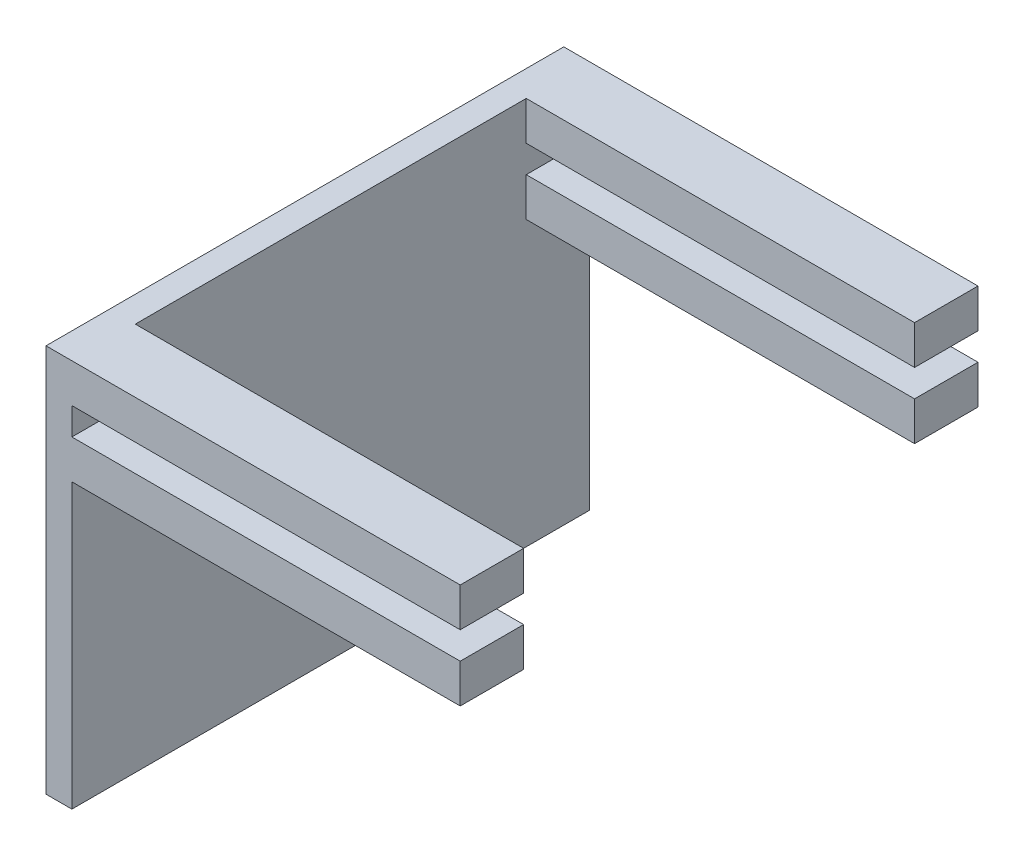
ISO-10303-21;
HEADER;
FILE_DESCRIPTION(('STEP AP214'),'2;1');
FILE_NAME('part.step','',(''),(''),'','','');
FILE_SCHEMA(('AUTOMOTIVE_DESIGN { 1 0 10303 214 1 1 1 1 }'));
ENDSEC;
DATA;
#1=APPLICATION_CONTEXT('core data for automotive mechanical design processes');
#2=APPLICATION_PROTOCOL_DEFINITION('international standard','automotive_design',2000,#1);
#3=PRODUCT_CONTEXT('',#1,'mechanical');
#4=PRODUCT('Part','Part','',(#3));
#5=PRODUCT_RELATED_PRODUCT_CATEGORY('part','',(#4));
#6=PRODUCT_DEFINITION_FORMATION('','',#4);
#7=PRODUCT_DEFINITION_CONTEXT('part definition',#1,'design');
#8=PRODUCT_DEFINITION('design','',#6,#7);
#9=PRODUCT_DEFINITION_SHAPE('','',#8);
#10=(LENGTH_UNIT() NAMED_UNIT(*) SI_UNIT(.MILLI.,.METRE.));
#11=(NAMED_UNIT(*) PLANE_ANGLE_UNIT() SI_UNIT($,.RADIAN.));
#12=(NAMED_UNIT(*) SI_UNIT($,.STERADIAN.) SOLID_ANGLE_UNIT());
#13=UNCERTAINTY_MEASURE_WITH_UNIT(LENGTH_MEASURE(1.E-05),#10,'distance_accuracy_value','');
#14=(GEOMETRIC_REPRESENTATION_CONTEXT(3) GLOBAL_UNCERTAINTY_ASSIGNED_CONTEXT((#13)) GLOBAL_UNIT_ASSIGNED_CONTEXT((#10,
#11,#12)) REPRESENTATION_CONTEXT('',''));
#15=CARTESIAN_POINT('',(0.,0.,0.));
#16=DIRECTION('',(0.,0.,1.));
#17=DIRECTION('',(1.,0.,0.));
#18=AXIS2_PLACEMENT_3D('',#15,#16,#17);
#19=CARTESIAN_POINT('',(2.,0.,40.));
#20=DIRECTION('',(-1.,0.,0.));
#21=DIRECTION('',(0.,0.,1.));
#22=AXIS2_PLACEMENT_3D('',#19,#20,#21);
#23=PLANE('',#22);
#24=DIRECTION('',(0.,0.,1.));
#25=VECTOR('',#24,1.);
#26=CARTESIAN_POINT('',(2.,24.9,0.));
#27=LINE('',#26,#25);
#28=CARTESIAN_POINT('',(2.,24.9,0.));
#29=VERTEX_POINT('',#28);
#30=CARTESIAN_POINT('',(2.,24.9,4.9));
#31=VERTEX_POINT('',#30);
#32=EDGE_CURVE('E282',#29,#31,#27,.T.);
#33=ORIENTED_EDGE('',*,*,#32,.F.);
#34=DIRECTION('',(0.,1.,0.));
#35=VECTOR('',#34,1.);
#36=CARTESIAN_POINT('',(2.,0.,0.));
#37=LINE('',#36,#35);
#38=CARTESIAN_POINT('',(2.,27.,0.));
#39=VERTEX_POINT('',#38);
#40=EDGE_CURVE('E469',#29,#39,#37,.T.);
#41=ORIENTED_EDGE('',*,*,#40,.T.);
#42=DIRECTION('',(0.,0.,-1.));
#43=VECTOR('',#42,1.);
#44=CARTESIAN_POINT('',(2.,27.,0.));
#45=LINE('',#44,#43);
#46=CARTESIAN_POINT('',(2.,27.,4.9));
#47=VERTEX_POINT('',#46);
#48=EDGE_CURVE('E383',#47,#39,#45,.T.);
#49=ORIENTED_EDGE('',*,*,#48,.F.);
#50=DIRECTION('',(0.,-1.,0.));
#51=VECTOR('',#50,1.);
#52=CARTESIAN_POINT('',(2.,30.,4.9));
#53=LINE('',#52,#51);
#54=CARTESIAN_POINT('',(2.,30.,4.9));
#55=VERTEX_POINT('',#54);
#56=EDGE_CURVE('E377',#55,#47,#53,.T.);
#57=ORIENTED_EDGE('',*,*,#56,.F.);
#58=DIRECTION('',(0.,0.,-1.));
#59=VECTOR('',#58,1.);
#60=CARTESIAN_POINT('',(2.,30.,40.));
#61=LINE('',#60,#59);
#62=CARTESIAN_POINT('',(2.,30.,35.1));
#63=VERTEX_POINT('',#62);
#64=EDGE_CURVE('E478',#63,#55,#61,.T.);
#65=ORIENTED_EDGE('',*,*,#64,.F.);
#66=DIRECTION('',(0.,1.,0.));
#67=VECTOR('',#66,1.);
#68=CARTESIAN_POINT('',(2.,30.,35.1));
#69=LINE('',#68,#67);
#70=CARTESIAN_POINT('',(2.,27.,35.1));
#71=VERTEX_POINT('',#70);
#72=EDGE_CURVE('E416',#71,#63,#69,.T.);
#73=ORIENTED_EDGE('',*,*,#72,.F.);
#74=DIRECTION('',(0.,0.,-1.));
#75=VECTOR('',#74,1.);
#76=CARTESIAN_POINT('',(2.,27.,40.));
#77=LINE('',#76,#75);
#78=CARTESIAN_POINT('',(2.,27.,40.));
#79=VERTEX_POINT('',#78);
#80=EDGE_CURVE('E410',#79,#71,#77,.T.);
#81=ORIENTED_EDGE('',*,*,#80,.F.);
#82=DIRECTION('',(0.,1.,0.));
#83=VECTOR('',#82,1.);
#84=CARTESIAN_POINT('',(2.,0.,40.));
#85=LINE('',#84,#83);
#86=CARTESIAN_POINT('',(2.,24.9,40.));
#87=VERTEX_POINT('',#86);
#88=EDGE_CURVE('E453',#87,#79,#85,.T.);
#89=ORIENTED_EDGE('',*,*,#88,.F.);
#90=DIRECTION('',(0.,0.,1.));
#91=VECTOR('',#90,1.);
#92=CARTESIAN_POINT('',(2.,24.9,40.));
#93=LINE('',#92,#91);
#94=CARTESIAN_POINT('',(2.,24.9,35.1));
#95=VERTEX_POINT('',#94);
#96=EDGE_CURVE('E346',#95,#87,#93,.T.);
#97=ORIENTED_EDGE('',*,*,#96,.F.);
#98=DIRECTION('',(0.,1.,0.));
#99=VECTOR('',#98,1.);
#100=CARTESIAN_POINT('',(2.,24.9,35.1));
#101=LINE('',#100,#99);
#102=CARTESIAN_POINT('',(2.,21.9,35.1));
#103=VERTEX_POINT('',#102);
#104=EDGE_CURVE('E358',#103,#95,#101,.T.);
#105=ORIENTED_EDGE('',*,*,#104,.F.);
#106=DIRECTION('',(0.,0.,-1.));
#107=VECTOR('',#106,1.);
#108=CARTESIAN_POINT('',(2.,21.9,40.));
#109=LINE('',#108,#107);
#110=CARTESIAN_POINT('',(2.,21.9,40.));
#111=VERTEX_POINT('',#110);
#112=EDGE_CURVE('E340',#111,#103,#109,.T.);
#113=ORIENTED_EDGE('',*,*,#112,.F.);
#114=CARTESIAN_POINT('',(2.,0.,40.));
#115=VERTEX_POINT('',#114);
#116=EDGE_CURVE('E454',#115,#111,#85,.T.);
#117=ORIENTED_EDGE('',*,*,#116,.F.);
#118=DIRECTION('',(0.,0.,-1.));
#119=VECTOR('',#118,1.);
#120=CARTESIAN_POINT('',(2.,0.,40.));
#121=LINE('',#120,#119);
#122=CARTESIAN_POINT('',(2.,0.,0.));
#123=VERTEX_POINT('',#122);
#124=EDGE_CURVE('E50',#115,#123,#121,.T.);
#125=ORIENTED_EDGE('',*,*,#124,.T.);
#126=CARTESIAN_POINT('',(2.,21.9,0.));
#127=VERTEX_POINT('',#126);
#128=EDGE_CURVE('E470',#123,#127,#37,.T.);
#129=ORIENTED_EDGE('',*,*,#128,.T.);
#130=DIRECTION('',(0.,0.,-1.));
#131=VECTOR('',#130,1.);
#132=CARTESIAN_POINT('',(2.,21.9,0.));
#133=LINE('',#132,#131);
#134=CARTESIAN_POINT('',(2.,21.9,4.9));
#135=VERTEX_POINT('',#134);
#136=EDGE_CURVE('E305',#135,#127,#133,.T.);
#137=ORIENTED_EDGE('',*,*,#136,.F.);
#138=DIRECTION('',(0.,-1.,0.));
#139=VECTOR('',#138,1.);
#140=CARTESIAN_POINT('',(2.,24.9,4.9));
#141=LINE('',#140,#139);
#142=EDGE_CURVE('E318',#31,#135,#141,.T.);
#143=ORIENTED_EDGE('',*,*,#142,.F.);
#144=EDGE_LOOP('',(#33,#41,#49,#57,#65,#73,#81,#89,#97,#105,#113,#117,#125,#129,#137,#143));
#145=FACE_BOUND('',#144,.T.);
#146=ADVANCED_FACE('F41',(#145),#23,.F.);
#147=CARTESIAN_POINT('',(0.,0.,40.));
#148=DIRECTION('',(1.,0.,0.));
#149=DIRECTION('',(0.,0.,-1.));
#150=AXIS2_PLACEMENT_3D('',#147,#148,#149);
#151=PLANE('',#150);
#152=DIRECTION('',(0.,1.,0.));
#153=VECTOR('',#152,1.);
#154=CARTESIAN_POINT('',(0.,0.,2.));
#155=LINE('',#154,#153);
#156=CARTESIAN_POINT('',(0.,1.17157287525381,2.));
#157=VERTEX_POINT('',#156);
#158=CARTESIAN_POINT('',(0.,4.,2.));
#159=VERTEX_POINT('',#158);
#160=EDGE_CURVE('E61',#157,#159,#155,.T.);
#161=ORIENTED_EDGE('',*,*,#160,.F.);
#162=DIRECTION('',(0.,0.,-1.));
#163=VECTOR('',#162,1.);
#164=CARTESIAN_POINT('',(0.,1.17157287525381,2.));
#165=LINE('',#164,#163);
#166=CARTESIAN_POINT('',(0.,1.17157287525381,0.));
#167=VERTEX_POINT('',#166);
#168=EDGE_CURVE('E283',#157,#167,#165,.T.);
#169=ORIENTED_EDGE('',*,*,#168,.T.);
#170=DIRECTION('',(0.,-1.,0.));
#171=VECTOR('',#170,1.);
#172=CARTESIAN_POINT('',(0.,0.,0.));
#173=LINE('',#172,#171);
#174=CARTESIAN_POINT('',(0.,0.,0.));
#175=VERTEX_POINT('',#174);
#176=EDGE_CURVE('E444',#167,#175,#173,.T.);
#177=ORIENTED_EDGE('',*,*,#176,.T.);
#178=DIRECTION('',(0.,0.,-1.));
#179=VECTOR('',#178,1.);
#180=CARTESIAN_POINT('',(0.,0.,40.));
#181=LINE('',#180,#179);
#182=CARTESIAN_POINT('',(0.,0.,40.));
#183=VERTEX_POINT('',#182);
#184=EDGE_CURVE('E11',#183,#175,#181,.T.);
#185=ORIENTED_EDGE('',*,*,#184,.F.);
#186=DIRECTION('',(0.,-1.,0.));
#187=VECTOR('',#186,1.);
#188=CARTESIAN_POINT('',(0.,0.,40.));
#189=LINE('',#188,#187);
#190=CARTESIAN_POINT('',(0.,30.,40.));
#191=VERTEX_POINT('',#190);
#192=EDGE_CURVE('E445',#191,#183,#189,.T.);
#193=ORIENTED_EDGE('',*,*,#192,.F.);
#194=DIRECTION('',(0.,0.,-1.));
#195=VECTOR('',#194,1.);
#196=CARTESIAN_POINT('',(0.,30.,40.));
#197=LINE('',#196,#195);
#198=CARTESIAN_POINT('',(0.,30.,0.));
#199=VERTEX_POINT('',#198);
#200=EDGE_CURVE('E461',#191,#199,#197,.T.);
#201=ORIENTED_EDGE('',*,*,#200,.T.);
#202=CARTESIAN_POINT('',(0.,16.8284271247462,0.));
#203=VERTEX_POINT('',#202);
#204=EDGE_CURVE('E462',#199,#203,#173,.T.);
#205=ORIENTED_EDGE('',*,*,#204,.T.);
#206=DIRECTION('',(0.,0.,-1.));
#207=VECTOR('',#206,1.);
#208=CARTESIAN_POINT('',(0.,16.8284271247462,2.));
#209=LINE('',#208,#207);
#210=CARTESIAN_POINT('',(0.,16.8284271247462,2.));
#211=VERTEX_POINT('',#210);
#212=EDGE_CURVE('E226',#211,#203,#209,.T.);
#213=ORIENTED_EDGE('',*,*,#212,.F.);
#214=CARTESIAN_POINT('',(0.,14.,2.));
#215=VERTEX_POINT('',#214);
#216=EDGE_CURVE('E242',#215,#211,#155,.T.);
#217=ORIENTED_EDGE('',*,*,#216,.F.);
#218=DIRECTION('',(0.,0.,-1.));
#219=VECTOR('',#218,1.);
#220=CARTESIAN_POINT('',(0.,14.,2.));
#221=LINE('',#220,#219);
#222=CARTESIAN_POINT('',(0.,14.,0.));
#223=VERTEX_POINT('',#222);
#224=EDGE_CURVE('E294',#215,#223,#221,.T.);
#225=ORIENTED_EDGE('',*,*,#224,.T.);
#226=CARTESIAN_POINT('',(0.,4.,0.));
#227=VERTEX_POINT('',#226);
#228=EDGE_CURVE('E466',#223,#227,#173,.T.);
#229=ORIENTED_EDGE('',*,*,#228,.T.);
#230=DIRECTION('',(0.,0.,-1.));
#231=VECTOR('',#230,1.);
#232=CARTESIAN_POINT('',(0.,4.,2.));
#233=LINE('',#232,#231);
#234=EDGE_CURVE('E57',#159,#227,#233,.T.);
#235=ORIENTED_EDGE('',*,*,#234,.F.);
#236=EDGE_LOOP('',(#161,#169,#177,#185,#193,#201,#205,#213,#217,#225,#229,#235));
#237=FACE_BOUND('',#236,.T.);
#238=ADVANCED_FACE('F43',(#237),#151,.F.);
#239=CARTESIAN_POINT('',(0.,0.,40.));
#240=DIRECTION('',(0.,1.,0.));
#241=DIRECTION('',(0.,0.,1.));
#242=AXIS2_PLACEMENT_3D('',#239,#240,#241);
#243=PLANE('',#242);
#244=DIRECTION('',(1.,0.,0.));
#245=VECTOR('',#244,1.);
#246=CARTESIAN_POINT('',(0.,0.,0.));
#247=LINE('',#246,#245);
#248=EDGE_CURVE('E465',#175,#123,#247,.T.);
#249=ORIENTED_EDGE('',*,*,#248,.T.);
#250=ORIENTED_EDGE('',*,*,#124,.F.);
#251=DIRECTION('',(1.,0.,0.));
#252=VECTOR('',#251,1.);
#253=CARTESIAN_POINT('',(0.,0.,40.));
#254=LINE('',#253,#252);
#255=EDGE_CURVE('E449',#183,#115,#254,.T.);
#256=ORIENTED_EDGE('',*,*,#255,.F.);
#257=ORIENTED_EDGE('',*,*,#184,.T.);
#258=EDGE_LOOP('',(#249,#250,#256,#257));
#259=FACE_BOUND('',#258,.T.);
#260=ADVANCED_FACE('F563',(#259),#243,.F.);
#261=CARTESIAN_POINT('',(0.,30.,40.));
#262=DIRECTION('',(0.,-1.,0.));
#263=DIRECTION('',(0.,0.,-1.));
#264=AXIS2_PLACEMENT_3D('',#261,#262,#263);
#265=PLANE('',#264);
#266=DIRECTION('',(-1.,0.,0.));
#267=VECTOR('',#266,1.);
#268=CARTESIAN_POINT('',(0.,30.,0.));
#269=LINE('',#268,#267);
#270=CARTESIAN_POINT('',(32.,30.,0.));
#271=VERTEX_POINT('',#270);
#272=EDGE_CURVE('E450',#271,#199,#269,.T.);
#273=ORIENTED_EDGE('',*,*,#272,.T.);
#274=ORIENTED_EDGE('',*,*,#200,.F.);
#275=DIRECTION('',(-1.,0.,0.));
#276=VECTOR('',#275,1.);
#277=CARTESIAN_POINT('',(0.,30.,40.));
#278=LINE('',#277,#276);
#279=CARTESIAN_POINT('',(32.,30.,40.));
#280=VERTEX_POINT('',#279);
#281=EDGE_CURVE('E458',#280,#191,#278,.T.);
#282=ORIENTED_EDGE('',*,*,#281,.F.);
#283=DIRECTION('',(0.,0.,1.));
#284=VECTOR('',#283,1.);
#285=CARTESIAN_POINT('',(32.,30.,40.));
#286=LINE('',#285,#284);
#287=CARTESIAN_POINT('',(32.,30.,35.1));
#288=VERTEX_POINT('',#287);
#289=EDGE_CURVE('E422',#288,#280,#286,.T.);
#290=ORIENTED_EDGE('',*,*,#289,.F.);
#291=DIRECTION('',(-1.,0.,0.));
#292=VECTOR('',#291,1.);
#293=CARTESIAN_POINT('',(32.,30.,35.1));
#294=LINE('',#293,#292);
#295=EDGE_CURVE('E426',#288,#63,#294,.T.);
#296=ORIENTED_EDGE('',*,*,#295,.T.);
#297=ORIENTED_EDGE('',*,*,#64,.T.);
#298=DIRECTION('',(-1.,0.,0.));
#299=VECTOR('',#298,1.);
#300=CARTESIAN_POINT('',(32.,30.,4.9));
#301=LINE('',#300,#299);
#302=CARTESIAN_POINT('',(32.,30.,4.9));
#303=VERTEX_POINT('',#302);
#304=EDGE_CURVE('E406',#303,#55,#301,.T.);
#305=ORIENTED_EDGE('',*,*,#304,.F.);
#306=DIRECTION('',(0.,0.,1.));
#307=VECTOR('',#306,1.);
#308=CARTESIAN_POINT('',(32.,30.,0.));
#309=LINE('',#308,#307);
#310=EDGE_CURVE('E382',#271,#303,#309,.T.);
#311=ORIENTED_EDGE('',*,*,#310,.F.);
#312=EDGE_LOOP('',(#273,#274,#282,#290,#296,#297,#305,#311));
#313=FACE_BOUND('',#312,.T.);
#314=ADVANCED_FACE('F522',(#313),#265,.F.);
#315=CARTESIAN_POINT('',(0.,0.,40.));
#316=DIRECTION('',(0.,0.,-1.));
#317=DIRECTION('',(-1.,0.,0.));
#318=AXIS2_PLACEMENT_3D('',#315,#316,#317);
#319=PLANE('',#318);
#320=ORIENTED_EDGE('',*,*,#192,.T.);
#321=ORIENTED_EDGE('',*,*,#255,.T.);
#322=ORIENTED_EDGE('',*,*,#116,.T.);
#323=DIRECTION('',(-1.,0.,0.));
#324=VECTOR('',#323,1.);
#325=CARTESIAN_POINT('',(32.,21.9,40.));
#326=LINE('',#325,#324);
#327=CARTESIAN_POINT('',(32.,21.9,40.));
#328=VERTEX_POINT('',#327);
#329=EDGE_CURVE('E374',#328,#111,#326,.T.);
#330=ORIENTED_EDGE('',*,*,#329,.F.);
#331=DIRECTION('',(0.,-1.,0.));
#332=VECTOR('',#331,1.);
#333=CARTESIAN_POINT('',(32.,24.9,40.));
#334=LINE('',#333,#332);
#335=CARTESIAN_POINT('',(32.,24.9,40.));
#336=VERTEX_POINT('',#335);
#337=EDGE_CURVE('E341',#336,#328,#334,.T.);
#338=ORIENTED_EDGE('',*,*,#337,.F.);
#339=DIRECTION('',(-1.,0.,0.));
#340=VECTOR('',#339,1.);
#341=CARTESIAN_POINT('',(32.,24.9,40.));
#342=LINE('',#341,#340);
#343=EDGE_CURVE('E355',#336,#87,#342,.T.);
#344=ORIENTED_EDGE('',*,*,#343,.T.);
#345=ORIENTED_EDGE('',*,*,#88,.T.);
#346=DIRECTION('',(-1.,0.,0.));
#347=VECTOR('',#346,1.);
#348=CARTESIAN_POINT('',(32.,27.,40.));
#349=LINE('',#348,#347);
#350=CARTESIAN_POINT('',(32.,27.,40.));
#351=VERTEX_POINT('',#350);
#352=EDGE_CURVE('E440',#351,#79,#349,.T.);
#353=ORIENTED_EDGE('',*,*,#352,.F.);
#354=DIRECTION('',(0.,-1.,0.));
#355=VECTOR('',#354,1.);
#356=CARTESIAN_POINT('',(32.,30.,40.));
#357=LINE('',#356,#355);
#358=EDGE_CURVE('E411',#280,#351,#357,.T.);
#359=ORIENTED_EDGE('',*,*,#358,.F.);
#360=ORIENTED_EDGE('',*,*,#281,.T.);
#361=EDGE_LOOP('',(#320,#321,#322,#330,#338,#344,#345,#353,#359,#360));
#362=FACE_BOUND('',#361,.T.);
#363=ADVANCED_FACE('F536',(#362),#319,.F.);
#364=CARTESIAN_POINT('',(0.,0.,0.));
#365=DIRECTION('',(0.,0.,-1.));
#366=DIRECTION('',(-1.,0.,0.));
#367=AXIS2_PLACEMENT_3D('',#364,#365,#366);
#368=PLANE('',#367);
#369=CARTESIAN_POINT('',(-1.,4.,0.));
#370=DIRECTION('',(0.,0.,-1.));
#371=DIRECTION('',(-1.,0.,0.));
#372=AXIS2_PLACEMENT_3D('',#369,#370,#371);
#373=CIRCLE('',#372,1.);
#374=CARTESIAN_POINT('',(-2.,4.,0.));
#375=VERTEX_POINT('',#374);
#376=EDGE_CURVE('E273',#227,#375,#373,.T.);
#377=ORIENTED_EDGE('',*,*,#376,.F.);
#378=ORIENTED_EDGE('',*,*,#228,.F.);
#379=CARTESIAN_POINT('',(-1.,14.,0.));
#380=DIRECTION('',(0.,0.,-1.));
#381=DIRECTION('',(-1.,0.,0.));
#382=AXIS2_PLACEMENT_3D('',#379,#380,#381);
#383=CIRCLE('',#382,1.);
#384=CARTESIAN_POINT('',(-2.,14.,0.));
#385=VERTEX_POINT('',#384);
#386=EDGE_CURVE('E265',#385,#223,#383,.T.);
#387=ORIENTED_EDGE('',*,*,#386,.F.);
#388=DIRECTION('',(0.,-1.,0.));
#389=VECTOR('',#388,1.);
#390=CARTESIAN_POINT('',(-2.,0.,0.));
#391=LINE('',#390,#389);
#392=EDGE_CURVE('E269',#385,#375,#391,.T.);
#393=ORIENTED_EDGE('',*,*,#392,.T.);
#394=EDGE_LOOP('',(#377,#378,#387,#393));
#395=FACE_BOUND('',#394,.T.);
#396=ORIENTED_EDGE('',*,*,#204,.F.);
#397=ORIENTED_EDGE('',*,*,#272,.F.);
#398=DIRECTION('',(0.,1.,0.));
#399=VECTOR('',#398,1.);
#400=CARTESIAN_POINT('',(32.,30.,0.));
#401=LINE('',#400,#399);
#402=CARTESIAN_POINT('',(32.,27.,0.));
#403=VERTEX_POINT('',#402);
#404=EDGE_CURVE('E378',#403,#271,#401,.T.);
#405=ORIENTED_EDGE('',*,*,#404,.F.);
#406=DIRECTION('',(-1.,0.,0.));
#407=VECTOR('',#406,1.);
#408=CARTESIAN_POINT('',(32.,27.,0.));
#409=LINE('',#408,#407);
#410=EDGE_CURVE('E392',#403,#39,#409,.T.);
#411=ORIENTED_EDGE('',*,*,#410,.T.);
#412=ORIENTED_EDGE('',*,*,#40,.F.);
#413=DIRECTION('',(-1.,0.,0.));
#414=VECTOR('',#413,1.);
#415=CARTESIAN_POINT('',(32.,24.9,0.));
#416=LINE('',#415,#414);
#417=CARTESIAN_POINT('',(32.,24.9,0.));
#418=VERTEX_POINT('',#417);
#419=EDGE_CURVE('E336',#418,#29,#416,.T.);
#420=ORIENTED_EDGE('',*,*,#419,.F.);
#421=DIRECTION('',(0.,1.,0.));
#422=VECTOR('',#421,1.);
#423=CARTESIAN_POINT('',(32.,24.9,0.));
#424=LINE('',#423,#422);
#425=CARTESIAN_POINT('',(32.,21.9,0.));
#426=VERTEX_POINT('',#425);
#427=EDGE_CURVE('E300',#426,#418,#424,.T.);
#428=ORIENTED_EDGE('',*,*,#427,.F.);
#429=DIRECTION('',(-1.,0.,0.));
#430=VECTOR('',#429,1.);
#431=CARTESIAN_POINT('',(32.,21.9,0.));
#432=LINE('',#431,#430);
#433=EDGE_CURVE('E314',#426,#127,#432,.T.);
#434=ORIENTED_EDGE('',*,*,#433,.T.);
#435=ORIENTED_EDGE('',*,*,#128,.F.);
#436=ORIENTED_EDGE('',*,*,#248,.F.);
#437=ORIENTED_EDGE('',*,*,#176,.F.);
#438=CARTESIAN_POINT('',(-1.,4.,0.));
#439=DIRECTION('',(0.,0.,-1.));
#440=DIRECTION('',(-1.,0.,0.));
#441=AXIS2_PLACEMENT_3D('',#438,#439,#440);
#442=CIRCLE('',#441,3.);
#443=CARTESIAN_POINT('',(-4.,4.,0.));
#444=VERTEX_POINT('',#443);
#445=EDGE_CURVE('E237',#167,#444,#442,.T.);
#446=ORIENTED_EDGE('',*,*,#445,.T.);
#447=DIRECTION('',(0.,-1.,0.));
#448=VECTOR('',#447,1.);
#449=CARTESIAN_POINT('',(-4.,0.,0.));
#450=LINE('',#449,#448);
#451=CARTESIAN_POINT('',(-4.,14.,0.));
#452=VERTEX_POINT('',#451);
#453=EDGE_CURVE('E260',#452,#444,#450,.T.);
#454=ORIENTED_EDGE('',*,*,#453,.F.);
#455=CARTESIAN_POINT('',(-1.,14.,0.));
#456=DIRECTION('',(0.,0.,-1.));
#457=DIRECTION('',(-1.,0.,0.));
#458=AXIS2_PLACEMENT_3D('',#455,#456,#457);
#459=CIRCLE('',#458,3.);
#460=EDGE_CURVE('E221',#452,#203,#459,.T.);
#461=ORIENTED_EDGE('',*,*,#460,.T.);
#462=EDGE_LOOP('',(#396,#397,#405,#411,#412,#420,#428,#434,#435,#436,#437,#446,#454,#461));
#463=FACE_BOUND('',#462,.T.);
#464=ADVANCED_FACE('F493',(#395,#463),#368,.T.);
#465=CARTESIAN_POINT('',(32.,27.,40.));
#466=DIRECTION('',(0.,1.,0.));
#467=DIRECTION('',(0.,0.,1.));
#468=AXIS2_PLACEMENT_3D('',#465,#466,#467);
#469=PLANE('',#468);
#470=ORIENTED_EDGE('',*,*,#80,.T.);
#471=DIRECTION('',(-1.,0.,0.));
#472=VECTOR('',#471,1.);
#473=CARTESIAN_POINT('',(32.,27.,35.1));
#474=LINE('',#473,#472);
#475=CARTESIAN_POINT('',(32.,27.,35.1));
#476=VERTEX_POINT('',#475);
#477=EDGE_CURVE('E436',#476,#71,#474,.T.);
#478=ORIENTED_EDGE('',*,*,#477,.F.);
#479=DIRECTION('',(0.,0.,-1.));
#480=VECTOR('',#479,1.);
#481=CARTESIAN_POINT('',(32.,27.,40.));
#482=LINE('',#481,#480);
#483=EDGE_CURVE('E415',#351,#476,#482,.T.);
#484=ORIENTED_EDGE('',*,*,#483,.F.);
#485=ORIENTED_EDGE('',*,*,#352,.T.);
#486=EDGE_LOOP('',(#470,#478,#484,#485));
#487=FACE_BOUND('',#486,.T.);
#488=ADVANCED_FACE('F532',(#487),#469,.F.);
#489=CARTESIAN_POINT('',(32.,30.,35.1));
#490=DIRECTION('',(0.,0.,1.));
#491=DIRECTION('',(1.,0.,0.));
#492=AXIS2_PLACEMENT_3D('',#489,#490,#491);
#493=PLANE('',#492);
#494=ORIENTED_EDGE('',*,*,#72,.T.);
#495=ORIENTED_EDGE('',*,*,#295,.F.);
#496=DIRECTION('',(0.,1.,0.));
#497=VECTOR('',#496,1.);
#498=CARTESIAN_POINT('',(32.,30.,35.1));
#499=LINE('',#498,#497);
#500=EDGE_CURVE('E419',#476,#288,#499,.T.);
#501=ORIENTED_EDGE('',*,*,#500,.F.);
#502=ORIENTED_EDGE('',*,*,#477,.T.);
#503=EDGE_LOOP('',(#494,#495,#501,#502));
#504=FACE_BOUND('',#503,.T.);
#505=ADVANCED_FACE('F527',(#504),#493,.F.);
#506=CARTESIAN_POINT('',(32.,0.,0.));
#507=DIRECTION('',(1.,0.,0.));
#508=DIRECTION('',(0.,0.,-1.));
#509=AXIS2_PLACEMENT_3D('',#506,#507,#508);
#510=PLANE('',#509);
#511=ORIENTED_EDGE('',*,*,#358,.T.);
#512=ORIENTED_EDGE('',*,*,#483,.T.);
#513=ORIENTED_EDGE('',*,*,#500,.T.);
#514=ORIENTED_EDGE('',*,*,#289,.T.);
#515=EDGE_LOOP('',(#511,#512,#513,#514));
#516=FACE_BOUND('',#515,.T.);
#517=ADVANCED_FACE('F566',(#516),#510,.T.);
#518=CARTESIAN_POINT('',(32.,30.,4.9));
#519=DIRECTION('',(0.,0.,-1.));
#520=DIRECTION('',(-1.,0.,0.));
#521=AXIS2_PLACEMENT_3D('',#518,#519,#520);
#522=PLANE('',#521);
#523=ORIENTED_EDGE('',*,*,#56,.T.);
#524=DIRECTION('',(-1.,0.,0.));
#525=VECTOR('',#524,1.);
#526=CARTESIAN_POINT('',(32.,27.,4.9));
#527=LINE('',#526,#525);
#528=CARTESIAN_POINT('',(32.,27.,4.9));
#529=VERTEX_POINT('',#528);
#530=EDGE_CURVE('E402',#529,#47,#527,.T.);
#531=ORIENTED_EDGE('',*,*,#530,.F.);
#532=DIRECTION('',(0.,-1.,0.));
#533=VECTOR('',#532,1.);
#534=CARTESIAN_POINT('',(32.,30.,4.9));
#535=LINE('',#534,#533);
#536=EDGE_CURVE('E386',#303,#529,#535,.T.);
#537=ORIENTED_EDGE('',*,*,#536,.F.);
#538=ORIENTED_EDGE('',*,*,#304,.T.);
#539=EDGE_LOOP('',(#523,#531,#537,#538));
#540=FACE_BOUND('',#539,.T.);
#541=ADVANCED_FACE('F520',(#540),#522,.F.);
#542=CARTESIAN_POINT('',(32.,27.,0.));
#543=DIRECTION('',(0.,1.,0.));
#544=DIRECTION('',(0.,0.,1.));
#545=AXIS2_PLACEMENT_3D('',#542,#543,#544);
#546=PLANE('',#545);
#547=ORIENTED_EDGE('',*,*,#48,.T.);
#548=ORIENTED_EDGE('',*,*,#410,.F.);
#549=DIRECTION('',(0.,0.,-1.));
#550=VECTOR('',#549,1.);
#551=CARTESIAN_POINT('',(32.,27.,0.));
#552=LINE('',#551,#550);
#553=EDGE_CURVE('E389',#529,#403,#552,.T.);
#554=ORIENTED_EDGE('',*,*,#553,.F.);
#555=ORIENTED_EDGE('',*,*,#530,.T.);
#556=EDGE_LOOP('',(#547,#548,#554,#555));
#557=FACE_BOUND('',#556,.T.);
#558=ADVANCED_FACE('F510',(#557),#546,.F.);
#559=CARTESIAN_POINT('',(32.,0.,0.));
#560=DIRECTION('',(-1.,0.,0.));
#561=DIRECTION('',(0.,0.,1.));
#562=AXIS2_PLACEMENT_3D('',#559,#560,#561);
#563=PLANE('',#562);
#564=ORIENTED_EDGE('',*,*,#404,.T.);
#565=ORIENTED_EDGE('',*,*,#310,.T.);
#566=ORIENTED_EDGE('',*,*,#536,.T.);
#567=ORIENTED_EDGE('',*,*,#553,.T.);
#568=EDGE_LOOP('',(#564,#565,#566,#567));
#569=FACE_BOUND('',#568,.T.);
#570=ADVANCED_FACE('F516',(#569),#563,.F.);
#571=CARTESIAN_POINT('',(32.,21.9,40.));
#572=DIRECTION('',(0.,1.,0.));
#573=DIRECTION('',(0.,0.,1.));
#574=AXIS2_PLACEMENT_3D('',#571,#572,#573);
#575=PLANE('',#574);
#576=ORIENTED_EDGE('',*,*,#112,.T.);
#577=DIRECTION('',(-1.,0.,0.));
#578=VECTOR('',#577,1.);
#579=CARTESIAN_POINT('',(32.,21.9,35.1));
#580=LINE('',#579,#578);
#581=CARTESIAN_POINT('',(32.,21.9,35.1));
#582=VERTEX_POINT('',#581);
#583=EDGE_CURVE('E370',#582,#103,#580,.T.);
#584=ORIENTED_EDGE('',*,*,#583,.F.);
#585=DIRECTION('',(0.,0.,-1.));
#586=VECTOR('',#585,1.);
#587=CARTESIAN_POINT('',(32.,21.9,40.));
#588=LINE('',#587,#586);
#589=EDGE_CURVE('E345',#328,#582,#588,.T.);
#590=ORIENTED_EDGE('',*,*,#589,.F.);
#591=ORIENTED_EDGE('',*,*,#329,.T.);
#592=EDGE_LOOP('',(#576,#584,#590,#591));
#593=FACE_BOUND('',#592,.T.);
#594=ADVANCED_FACE('F631',(#593),#575,.F.);
#595=CARTESIAN_POINT('',(32.,24.9,35.1));
#596=DIRECTION('',(0.,0.,1.));
#597=DIRECTION('',(1.,0.,0.));
#598=AXIS2_PLACEMENT_3D('',#595,#596,#597);
#599=PLANE('',#598);
#600=ORIENTED_EDGE('',*,*,#104,.T.);
#601=DIRECTION('',(-1.,0.,0.));
#602=VECTOR('',#601,1.);
#603=CARTESIAN_POINT('',(32.,24.9,35.1));
#604=LINE('',#603,#602);
#605=CARTESIAN_POINT('',(32.,24.9,35.1));
#606=VERTEX_POINT('',#605);
#607=EDGE_CURVE('E366',#606,#95,#604,.T.);
#608=ORIENTED_EDGE('',*,*,#607,.F.);
#609=DIRECTION('',(0.,1.,0.));
#610=VECTOR('',#609,1.);
#611=CARTESIAN_POINT('',(32.,24.9,35.1));
#612=LINE('',#611,#610);
#613=EDGE_CURVE('E349',#582,#606,#612,.T.);
#614=ORIENTED_EDGE('',*,*,#613,.F.);
#615=ORIENTED_EDGE('',*,*,#583,.T.);
#616=EDGE_LOOP('',(#600,#608,#614,#615));
#617=FACE_BOUND('',#616,.T.);
#618=ADVANCED_FACE('F640',(#617),#599,.F.);
#619=CARTESIAN_POINT('',(32.,24.9,40.));
#620=DIRECTION('',(0.,-1.,0.));
#621=DIRECTION('',(0.,0.,-1.));
#622=AXIS2_PLACEMENT_3D('',#619,#620,#621);
#623=PLANE('',#622);
#624=ORIENTED_EDGE('',*,*,#96,.T.);
#625=ORIENTED_EDGE('',*,*,#343,.F.);
#626=DIRECTION('',(0.,0.,1.));
#627=VECTOR('',#626,1.);
#628=CARTESIAN_POINT('',(32.,24.9,40.));
#629=LINE('',#628,#627);
#630=EDGE_CURVE('E352',#606,#336,#629,.T.);
#631=ORIENTED_EDGE('',*,*,#630,.F.);
#632=ORIENTED_EDGE('',*,*,#607,.T.);
#633=EDGE_LOOP('',(#624,#625,#631,#632));
#634=FACE_BOUND('',#633,.T.);
#635=ADVANCED_FACE('F650',(#634),#623,.F.);
#636=CARTESIAN_POINT('',(32.,0.,0.));
#637=DIRECTION('',(1.,0.,0.));
#638=DIRECTION('',(0.,0.,-1.));
#639=AXIS2_PLACEMENT_3D('',#636,#637,#638);
#640=PLANE('',#639);
#641=ORIENTED_EDGE('',*,*,#337,.T.);
#642=ORIENTED_EDGE('',*,*,#589,.T.);
#643=ORIENTED_EDGE('',*,*,#613,.T.);
#644=ORIENTED_EDGE('',*,*,#630,.T.);
#645=EDGE_LOOP('',(#641,#642,#643,#644));
#646=FACE_BOUND('',#645,.T.);
#647=ADVANCED_FACE('F660',(#646),#640,.T.);
#648=CARTESIAN_POINT('',(32.,24.9,0.));
#649=DIRECTION('',(0.,-1.,0.));
#650=DIRECTION('',(0.,0.,-1.));
#651=AXIS2_PLACEMENT_3D('',#648,#649,#650);
#652=PLANE('',#651);
#653=ORIENTED_EDGE('',*,*,#32,.T.);
#654=DIRECTION('',(-1.,0.,0.));
#655=VECTOR('',#654,1.);
#656=CARTESIAN_POINT('',(32.,24.9,4.9));
#657=LINE('',#656,#655);
#658=CARTESIAN_POINT('',(32.,24.9,4.9));
#659=VERTEX_POINT('',#658);
#660=EDGE_CURVE('E332',#659,#31,#657,.T.);
#661=ORIENTED_EDGE('',*,*,#660,.F.);
#662=DIRECTION('',(0.,0.,1.));
#663=VECTOR('',#662,1.);
#664=CARTESIAN_POINT('',(32.,24.9,0.));
#665=LINE('',#664,#663);
#666=EDGE_CURVE('E304',#418,#659,#665,.T.);
#667=ORIENTED_EDGE('',*,*,#666,.F.);
#668=ORIENTED_EDGE('',*,*,#419,.T.);
#669=EDGE_LOOP('',(#653,#661,#667,#668));
#670=FACE_BOUND('',#669,.T.);
#671=ADVANCED_FACE('F506',(#670),#652,.F.);
#672=CARTESIAN_POINT('',(32.,24.9,4.9));
#673=DIRECTION('',(0.,0.,-1.));
#674=DIRECTION('',(-1.,0.,0.));
#675=AXIS2_PLACEMENT_3D('',#672,#673,#674);
#676=PLANE('',#675);
#677=ORIENTED_EDGE('',*,*,#142,.T.);
#678=DIRECTION('',(-1.,0.,0.));
#679=VECTOR('',#678,1.);
#680=CARTESIAN_POINT('',(32.,21.9,4.9));
#681=LINE('',#680,#679);
#682=CARTESIAN_POINT('',(32.,21.9,4.9));
#683=VERTEX_POINT('',#682);
#684=EDGE_CURVE('E328',#683,#135,#681,.T.);
#685=ORIENTED_EDGE('',*,*,#684,.F.);
#686=DIRECTION('',(0.,-1.,0.));
#687=VECTOR('',#686,1.);
#688=CARTESIAN_POINT('',(32.,24.9,4.9));
#689=LINE('',#688,#687);
#690=EDGE_CURVE('E308',#659,#683,#689,.T.);
#691=ORIENTED_EDGE('',*,*,#690,.F.);
#692=ORIENTED_EDGE('',*,*,#660,.T.);
#693=EDGE_LOOP('',(#677,#685,#691,#692));
#694=FACE_BOUND('',#693,.T.);
#695=ADVANCED_FACE('F502',(#694),#676,.F.);
#696=CARTESIAN_POINT('',(32.,21.9,0.));
#697=DIRECTION('',(0.,1.,0.));
#698=DIRECTION('',(0.,0.,1.));
#699=AXIS2_PLACEMENT_3D('',#696,#697,#698);
#700=PLANE('',#699);
#701=ORIENTED_EDGE('',*,*,#136,.T.);
#702=ORIENTED_EDGE('',*,*,#433,.F.);
#703=DIRECTION('',(0.,0.,-1.));
#704=VECTOR('',#703,1.);
#705=CARTESIAN_POINT('',(32.,21.9,0.));
#706=LINE('',#705,#704);
#707=EDGE_CURVE('E311',#683,#426,#706,.T.);
#708=ORIENTED_EDGE('',*,*,#707,.F.);
#709=ORIENTED_EDGE('',*,*,#684,.T.);
#710=EDGE_LOOP('',(#701,#702,#708,#709));
#711=FACE_BOUND('',#710,.T.);
#712=ADVANCED_FACE('F499',(#711),#700,.F.);
#713=CARTESIAN_POINT('',(32.,0.,0.));
#714=DIRECTION('',(-1.,0.,0.));
#715=DIRECTION('',(0.,0.,1.));
#716=AXIS2_PLACEMENT_3D('',#713,#714,#715);
#717=PLANE('',#716);
#718=ORIENTED_EDGE('',*,*,#427,.T.);
#719=ORIENTED_EDGE('',*,*,#666,.T.);
#720=ORIENTED_EDGE('',*,*,#690,.T.);
#721=ORIENTED_EDGE('',*,*,#707,.T.);
#722=EDGE_LOOP('',(#718,#719,#720,#721));
#723=FACE_BOUND('',#722,.T.);
#724=ADVANCED_FACE('F695',(#723),#717,.F.);
#725=CARTESIAN_POINT('',(-4.,0.,2.));
#726=DIRECTION('',(1.,0.,0.));
#727=DIRECTION('',(0.,1.,0.));
#728=AXIS2_PLACEMENT_3D('',#725,#726,#727);
#729=PLANE('',#728);
#730=ORIENTED_EDGE('',*,*,#453,.T.);
#731=DIRECTION('',(0.,0.,-1.));
#732=VECTOR('',#731,1.);
#733=CARTESIAN_POINT('',(-4.,4.,2.));
#734=LINE('',#733,#732);
#735=CARTESIAN_POINT('',(-4.,4.,2.));
#736=VERTEX_POINT('',#735);
#737=EDGE_CURVE('E232',#736,#444,#734,.T.);
#738=ORIENTED_EDGE('',*,*,#737,.F.);
#739=DIRECTION('',(0.,-1.,0.));
#740=VECTOR('',#739,1.);
#741=CARTESIAN_POINT('',(-4.,0.,2.));
#742=LINE('',#741,#740);
#743=CARTESIAN_POINT('',(-4.,14.,2.));
#744=VERTEX_POINT('',#743);
#745=EDGE_CURVE('E230',#744,#736,#742,.T.);
#746=ORIENTED_EDGE('',*,*,#745,.F.);
#747=DIRECTION('',(0.,0.,-1.));
#748=VECTOR('',#747,1.);
#749=CARTESIAN_POINT('',(-4.,14.,2.));
#750=LINE('',#749,#748);
#751=EDGE_CURVE('E214',#744,#452,#750,.T.);
#752=ORIENTED_EDGE('',*,*,#751,.T.);
#753=EDGE_LOOP('',(#730,#738,#746,#752));
#754=FACE_BOUND('',#753,.T.);
#755=ADVANCED_FACE('F231',(#754),#729,.F.);
#756=CARTESIAN_POINT('',(-1.,4.,2.));
#757=DIRECTION('',(0.,0.,-1.));
#758=DIRECTION('',(-1.,0.,0.));
#759=AXIS2_PLACEMENT_3D('',#756,#757,#758);
#760=CYLINDRICAL_SURFACE('',#759,3.);
#761=ORIENTED_EDGE('',*,*,#445,.F.);
#762=ORIENTED_EDGE('',*,*,#168,.F.);
#763=CARTESIAN_POINT('',(-1.,4.,2.));
#764=DIRECTION('',(0.,0.,-1.));
#765=DIRECTION('',(-1.,0.,0.));
#766=AXIS2_PLACEMENT_3D('',#763,#764,#765);
#767=CIRCLE('',#766,3.);
#768=EDGE_CURVE('E227',#157,#736,#767,.T.);
#769=ORIENTED_EDGE('',*,*,#768,.T.);
#770=ORIENTED_EDGE('',*,*,#737,.T.);
#771=EDGE_LOOP('',(#761,#762,#769,#770));
#772=FACE_BOUND('',#771,.T.);
#773=ADVANCED_FACE('F560',(#772),#760,.T.);
#774=CARTESIAN_POINT('',(-1.,4.,2.));
#775=DIRECTION('',(0.,0.,-1.));
#776=DIRECTION('',(-1.,0.,0.));
#777=AXIS2_PLACEMENT_3D('',#774,#775,#776);
#778=CYLINDRICAL_SURFACE('',#777,1.);
#779=ORIENTED_EDGE('',*,*,#376,.T.);
#780=DIRECTION('',(0.,0.,-1.));
#781=VECTOR('',#780,1.);
#782=CARTESIAN_POINT('',(-2.,4.,2.));
#783=LINE('',#782,#781);
#784=CARTESIAN_POINT('',(-2.,4.,2.));
#785=VERTEX_POINT('',#784);
#786=EDGE_CURVE('E288',#785,#375,#783,.T.);
#787=ORIENTED_EDGE('',*,*,#786,.F.);
#788=CARTESIAN_POINT('',(-1.,4.,2.));
#789=DIRECTION('',(0.,0.,-1.));
#790=DIRECTION('',(-1.,0.,0.));
#791=AXIS2_PLACEMENT_3D('',#788,#789,#790);
#792=CIRCLE('',#791,1.);
#793=EDGE_CURVE('E255',#159,#785,#792,.T.);
#794=ORIENTED_EDGE('',*,*,#793,.F.);
#795=ORIENTED_EDGE('',*,*,#234,.T.);
#796=EDGE_LOOP('',(#779,#787,#794,#795));
#797=FACE_BOUND('',#796,.T.);
#798=ADVANCED_FACE('F548',(#797),#778,.F.);
#799=CARTESIAN_POINT('',(-2.,0.,2.));
#800=DIRECTION('',(1.,0.,0.));
#801=DIRECTION('',(0.,1.,0.));
#802=AXIS2_PLACEMENT_3D('',#799,#800,#801);
#803=PLANE('',#802);
#804=ORIENTED_EDGE('',*,*,#392,.F.);
#805=DIRECTION('',(0.,0.,-1.));
#806=VECTOR('',#805,1.);
#807=CARTESIAN_POINT('',(-2.,14.,2.));
#808=LINE('',#807,#806);
#809=CARTESIAN_POINT('',(-2.,14.,2.));
#810=VERTEX_POINT('',#809);
#811=EDGE_CURVE('E291',#810,#385,#808,.T.);
#812=ORIENTED_EDGE('',*,*,#811,.F.);
#813=DIRECTION('',(0.,-1.,0.));
#814=VECTOR('',#813,1.);
#815=CARTESIAN_POINT('',(-2.,0.,2.));
#816=LINE('',#815,#814);
#817=EDGE_CURVE('E251',#810,#785,#816,.T.);
#818=ORIENTED_EDGE('',*,*,#817,.T.);
#819=ORIENTED_EDGE('',*,*,#786,.T.);
#820=EDGE_LOOP('',(#804,#812,#818,#819));
#821=FACE_BOUND('',#820,.T.);
#822=ADVANCED_FACE('F552',(#821),#803,.T.);
#823=CARTESIAN_POINT('',(-1.,14.,2.));
#824=DIRECTION('',(0.,0.,-1.));
#825=DIRECTION('',(-1.,0.,0.));
#826=AXIS2_PLACEMENT_3D('',#823,#824,#825);
#827=CYLINDRICAL_SURFACE('',#826,1.);
#828=ORIENTED_EDGE('',*,*,#386,.T.);
#829=ORIENTED_EDGE('',*,*,#224,.F.);
#830=CARTESIAN_POINT('',(-1.,14.,2.));
#831=DIRECTION('',(0.,0.,-1.));
#832=DIRECTION('',(-1.,0.,0.));
#833=AXIS2_PLACEMENT_3D('',#830,#831,#832);
#834=CIRCLE('',#833,1.);
#835=EDGE_CURVE('E246',#810,#215,#834,.T.);
#836=ORIENTED_EDGE('',*,*,#835,.F.);
#837=ORIENTED_EDGE('',*,*,#811,.T.);
#838=EDGE_LOOP('',(#828,#829,#836,#837));
#839=FACE_BOUND('',#838,.T.);
#840=ADVANCED_FACE('F556',(#839),#827,.F.);
#841=CARTESIAN_POINT('',(-1.,14.,2.));
#842=DIRECTION('',(0.,0.,-1.));
#843=DIRECTION('',(-1.,0.,0.));
#844=AXIS2_PLACEMENT_3D('',#841,#842,#843);
#845=CYLINDRICAL_SURFACE('',#844,3.);
#846=ORIENTED_EDGE('',*,*,#460,.F.);
#847=ORIENTED_EDGE('',*,*,#751,.F.);
#848=CARTESIAN_POINT('',(-1.,14.,2.));
#849=DIRECTION('',(0.,0.,-1.));
#850=DIRECTION('',(-1.,0.,0.));
#851=AXIS2_PLACEMENT_3D('',#848,#849,#850);
#852=CIRCLE('',#851,3.);
#853=EDGE_CURVE('E219',#744,#211,#852,.T.);
#854=ORIENTED_EDGE('',*,*,#853,.T.);
#855=ORIENTED_EDGE('',*,*,#212,.T.);
#856=EDGE_LOOP('',(#846,#847,#854,#855));
#857=FACE_BOUND('',#856,.T.);
#858=ADVANCED_FACE('F216',(#857),#845,.T.);
#859=CARTESIAN_POINT('',(0.,0.,2.));
#860=DIRECTION('',(0.,0.,-1.));
#861=DIRECTION('',(-1.,0.,0.));
#862=AXIS2_PLACEMENT_3D('',#859,#860,#861);
#863=PLANE('',#862);
#864=ORIENTED_EDGE('',*,*,#745,.T.);
#865=ORIENTED_EDGE('',*,*,#768,.F.);
#866=ORIENTED_EDGE('',*,*,#160,.T.);
#867=ORIENTED_EDGE('',*,*,#793,.T.);
#868=ORIENTED_EDGE('',*,*,#817,.F.);
#869=ORIENTED_EDGE('',*,*,#835,.T.);
#870=ORIENTED_EDGE('',*,*,#216,.T.);
#871=ORIENTED_EDGE('',*,*,#853,.F.);
#872=EDGE_LOOP('',(#864,#865,#866,#867,#868,#869,#870,#871));
#873=FACE_BOUND('',#872,.T.);
#874=ADVANCED_FACE('F240',(#873),#863,.F.);
#875=CLOSED_SHELL('',(#146,#238,#260,#314,#363,#464,#488,#505,#517,#541,#558,#570,#594,#618,
#635,#647,#671,#695,#712,#724,#755,#773,#798,#822,#840,#858,#874));
#876=MANIFOLD_SOLID_BREP('B2',#875);
#877=ADVANCED_BREP_SHAPE_REPRESENTATION('',(#18,#876),#14);
#878=SHAPE_DEFINITION_REPRESENTATION(#9,#877);
ENDSEC;
END-ISO-10303-21;
